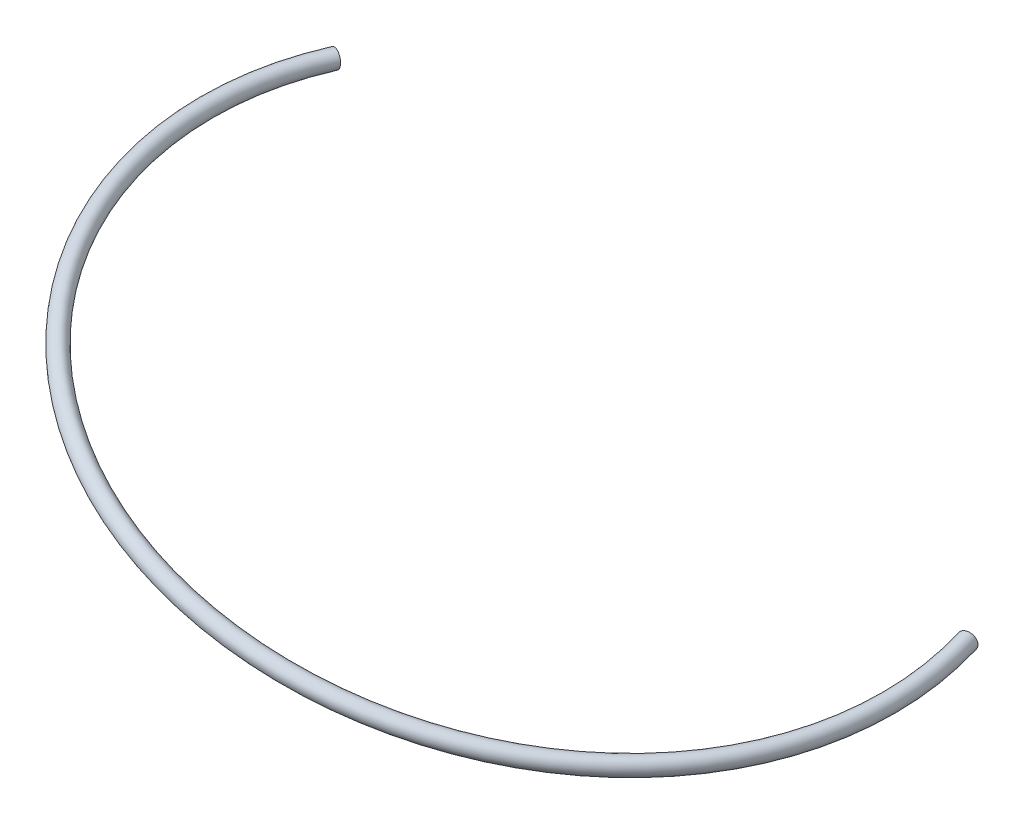
ISO-10303-21;
HEADER;
FILE_DESCRIPTION(('STEP AP214'),'2;1');
FILE_NAME('part.step','',(''),(''),'','','');
FILE_SCHEMA(('AUTOMOTIVE_DESIGN { 1 0 10303 214 1 1 1 1 }'));
ENDSEC;
DATA;
#1=APPLICATION_CONTEXT('core data for automotive mechanical design processes');
#2=APPLICATION_PROTOCOL_DEFINITION('international standard','automotive_design',2000,#1);
#3=PRODUCT_CONTEXT('',#1,'mechanical');
#4=PRODUCT('Part','Part','',(#3));
#5=PRODUCT_RELATED_PRODUCT_CATEGORY('part','',(#4));
#6=PRODUCT_DEFINITION_FORMATION('','',#4);
#7=PRODUCT_DEFINITION_CONTEXT('part definition',#1,'design');
#8=PRODUCT_DEFINITION('design','',#6,#7);
#9=PRODUCT_DEFINITION_SHAPE('','',#8);
#10=(LENGTH_UNIT() NAMED_UNIT(*) SI_UNIT(.MILLI.,.METRE.));
#11=(NAMED_UNIT(*) PLANE_ANGLE_UNIT() SI_UNIT($,.RADIAN.));
#12=(NAMED_UNIT(*) SI_UNIT($,.STERADIAN.) SOLID_ANGLE_UNIT());
#13=UNCERTAINTY_MEASURE_WITH_UNIT(LENGTH_MEASURE(1.E-05),#10,'distance_accuracy_value','');
#14=(GEOMETRIC_REPRESENTATION_CONTEXT(3) GLOBAL_UNCERTAINTY_ASSIGNED_CONTEXT((#13)) GLOBAL_UNIT_ASSIGNED_CONTEXT((#10,
#11,#12)) REPRESENTATION_CONTEXT('',''));
#15=CARTESIAN_POINT('',(0.,0.,0.));
#16=DIRECTION('',(0.,0.,1.));
#17=DIRECTION('',(1.,0.,0.));
#18=AXIS2_PLACEMENT_3D('',#15,#16,#17);
#19=CARTESIAN_POINT('',(88.7500000000008,25.8499999999997,22.25));
#20=DIRECTION('',(-0.304582566500144,0.0782496659330951,0.94926626926566));
#21=DIRECTION('',(0.952185867207383,0.,0.305519351744737));
#22=AXIS2_PLACEMENT_3D('',#19,#20,#21);
#23=PLANE('',#22);
#24=CARTESIAN_POINT('',(88.7500000000008,25.8499999999997,22.25));
#25=DIRECTION('',(-0.304582566500144,0.0782496659330951,0.94926626926566));
#26=DIRECTION('',(0.952185867207383,0.,0.305519351744737));
#27=AXIS2_PLACEMENT_3D('',#24,#25,#26);
#28=CIRCLE('',#27,2.);
#29=CARTESIAN_POINT('',(86.9111804898761,26.3224072491469,21.621053102291));
#30=VERTEX_POINT('',#29);
#31=EDGE_CURVE('E55',#30,#30,#28,.T.);
#32=ORIENTED_EDGE('',*,*,#31,.F.);
#33=EDGE_LOOP('',(#32));
#34=FACE_BOUND('',#33,.T.);
#35=ADVANCED_FACE('F49',(#34),#23,.F.);
#36=CARTESIAN_POINT('',(240.750000000001,-13.1999999999998,26.9999999999993));
#37=DIRECTION('',(-0.248420193142911,0.063821108830464,-0.966547605504503));
#38=DIRECTION('',(-0.850537601594093,0.463133891162479,0.249184243344698));
#39=AXIS2_PLACEMENT_3D('',#36,#37,#38);
#40=PLANE('',#39);
#41=CARTESIAN_POINT('',(240.750000000001,-13.1999999999998,26.9999999999993));
#42=DIRECTION('',(-0.248420193142911,0.063821108830464,-0.966547605504503));
#43=DIRECTION('',(-0.850537601594093,0.463133891162479,0.249184243344698));
#44=AXIS2_PLACEMENT_3D('',#41,#42,#43);
#45=CIRCLE('',#44,2.);
#46=CARTESIAN_POINT('',(242.622295110456,-13.6810073951529,26.4870254341834));
#47=VERTEX_POINT('',#46);
#48=EDGE_CURVE('E11',#47,#47,#45,.T.);
#49=ORIENTED_EDGE('',*,*,#48,.T.);
#50=EDGE_LOOP('',(#49));
#51=FACE_BOUND('',#50,.T.);
#52=ADVANCED_FACE('F64',(#51),#40,.T.);
#53=CARTESIAN_POINT('',(164.064452425965,6.50112258398736,48.0104354017061));
#54=DIRECTION('',(0.248827575803689,0.96854779826277,0.));
#55=DIRECTION('',(-0.96854779826277,0.248827575803689,0.));
#56=AXIS2_PLACEMENT_3D('',#53,#54,#55);
#57=TOROIDAL_SURFACE('',#56,81.9160901994731,2.);
#58=CARTESIAN_POINT('',(164.064452425965,6.50112258398736,48.0104354017061));
#59=DIRECTION('',(0.248827575803689,0.96854779826277,0.));
#60=DIRECTION('',(-0.96854779826277,0.248827575803689,0.));
#61=AXIS2_PLACEMENT_3D('',#58,#59,#60);
#62=CIRCLE('',#61,83.9160901994731);
#63=EDGE_CURVE('',#30,#47,#62,.T.);
#64=ORIENTED_EDGE('',*,*,#31,.T.);
#65=ORIENTED_EDGE('',*,*,#48,.F.);
#66=ORIENTED_EDGE('',*,*,#63,.T.);
#67=ORIENTED_EDGE('',*,*,#63,.F.);
#68=EDGE_LOOP('',(#64,#66,#65,#67));
#69=FACE_BOUND('',#68,.T.);
#70=ADVANCED_FACE('F61',(#69),#57,.T.);
#71=CLOSED_SHELL('',(#35,#52,#70));
#72=MANIFOLD_SOLID_BREP('B2',#71);
#73=ADVANCED_BREP_SHAPE_REPRESENTATION('',(#18,#72),#14);
#74=SHAPE_DEFINITION_REPRESENTATION(#9,#73);
ENDSEC;
END-ISO-10303-21;
